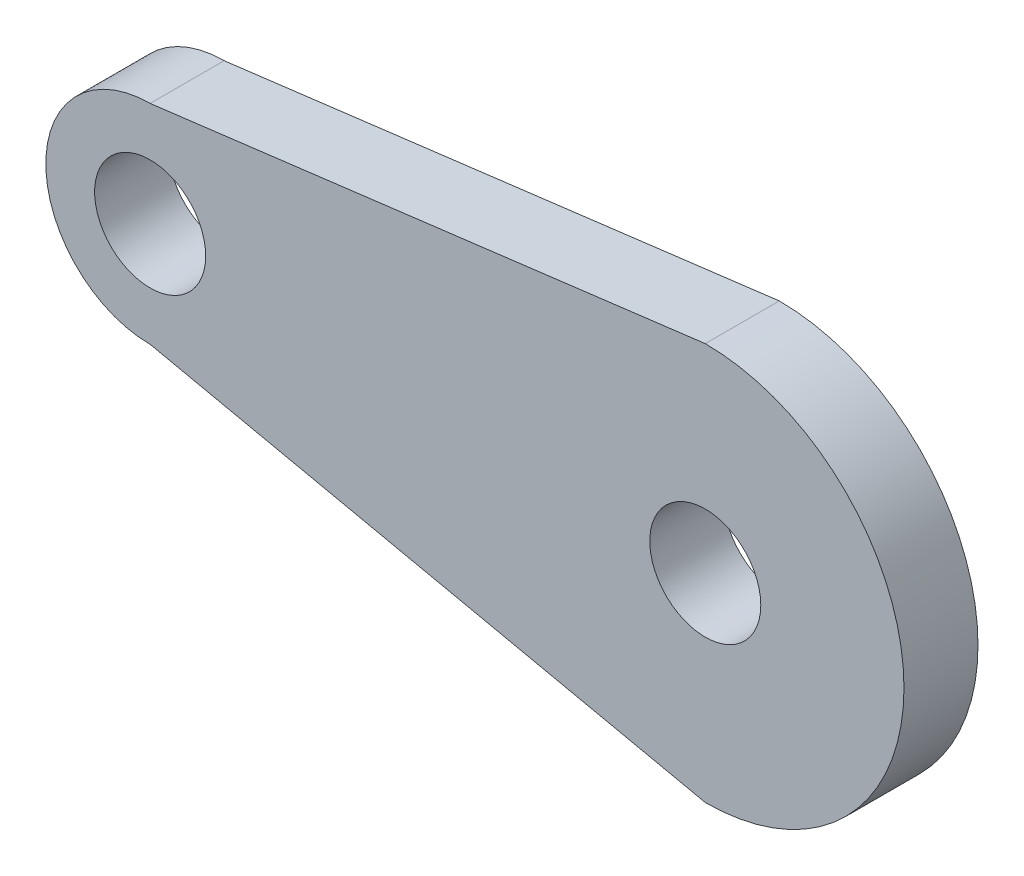
ISO-10303-21;
HEADER;
FILE_DESCRIPTION(('STEP AP214'),'2;1');
FILE_NAME('part.step','',(''),(''),'','','');
FILE_SCHEMA(('AUTOMOTIVE_DESIGN { 1 0 10303 214 1 1 1 1 }'));
ENDSEC;
DATA;
#1=APPLICATION_CONTEXT('core data for automotive mechanical design processes');
#2=APPLICATION_PROTOCOL_DEFINITION('international standard','automotive_design',2000,#1);
#3=PRODUCT_CONTEXT('',#1,'mechanical');
#4=PRODUCT('Part','Part','',(#3));
#5=PRODUCT_RELATED_PRODUCT_CATEGORY('part','',(#4));
#6=PRODUCT_DEFINITION_FORMATION('','',#4);
#7=PRODUCT_DEFINITION_CONTEXT('part definition',#1,'design');
#8=PRODUCT_DEFINITION('design','',#6,#7);
#9=PRODUCT_DEFINITION_SHAPE('','',#8);
#10=(LENGTH_UNIT() NAMED_UNIT(*) SI_UNIT(.MILLI.,.METRE.));
#11=(NAMED_UNIT(*) PLANE_ANGLE_UNIT() SI_UNIT($,.RADIAN.));
#12=(NAMED_UNIT(*) SI_UNIT($,.STERADIAN.) SOLID_ANGLE_UNIT());
#13=UNCERTAINTY_MEASURE_WITH_UNIT(LENGTH_MEASURE(1.E-05),#10,'distance_accuracy_value','');
#14=(GEOMETRIC_REPRESENTATION_CONTEXT(3) GLOBAL_UNCERTAINTY_ASSIGNED_CONTEXT((#13)) GLOBAL_UNIT_ASSIGNED_CONTEXT((#10,
#11,#12)) REPRESENTATION_CONTEXT('',''));
#15=CARTESIAN_POINT('',(0.,0.,0.));
#16=DIRECTION('',(0.,0.,1.));
#17=DIRECTION('',(1.,0.,0.));
#18=AXIS2_PLACEMENT_3D('',#15,#16,#17);
#19=CARTESIAN_POINT('',(0.,-2.81879194630873,2.));
#20=DIRECTION('',(0.,0.,-1.));
#21=DIRECTION('',(-1.,0.,0.));
#22=AXIS2_PLACEMENT_3D('',#19,#20,#21);
#23=CYLINDRICAL_SURFACE('',#22,2.81879194630873);
#24=CARTESIAN_POINT('',(0.,-2.81879194630873,0.));
#25=DIRECTION('',(0.,0.,1.));
#26=DIRECTION('',(1.,0.,0.));
#27=AXIS2_PLACEMENT_3D('',#24,#25,#26);
#28=CIRCLE('',#27,2.81879194630873);
#29=CARTESIAN_POINT('',(0.,0.,0.));
#30=VERTEX_POINT('',#29);
#31=CARTESIAN_POINT('',(0.,-5.63758389261745,0.));
#32=VERTEX_POINT('',#31);
#33=EDGE_CURVE('E107',#30,#32,#28,.T.);
#34=ORIENTED_EDGE('',*,*,#33,.T.);
#35=DIRECTION('',(0.,0.,-1.));
#36=VECTOR('',#35,1.);
#37=CARTESIAN_POINT('',(0.,-5.63758389261745,2.));
#38=LINE('',#37,#36);
#39=CARTESIAN_POINT('',(0.,-5.63758389261745,2.));
#40=VERTEX_POINT('',#39);
#41=EDGE_CURVE('E11',#40,#32,#38,.T.);
#42=ORIENTED_EDGE('',*,*,#41,.F.);
#43=CARTESIAN_POINT('',(0.,-2.81879194630873,2.));
#44=DIRECTION('',(0.,0.,1.));
#45=DIRECTION('',(1.,0.,0.));
#46=AXIS2_PLACEMENT_3D('',#43,#44,#45);
#47=CIRCLE('',#46,2.81879194630873);
#48=CARTESIAN_POINT('',(0.,0.,2.));
#49=VERTEX_POINT('',#48);
#50=EDGE_CURVE('E87',#49,#40,#47,.T.);
#51=ORIENTED_EDGE('',*,*,#50,.F.);
#52=DIRECTION('',(0.,0.,-1.));
#53=VECTOR('',#52,1.);
#54=CARTESIAN_POINT('',(0.,0.,2.));
#55=LINE('',#54,#53);
#56=EDGE_CURVE('E53',#49,#30,#55,.T.);
#57=ORIENTED_EDGE('',*,*,#56,.T.);
#58=EDGE_LOOP('',(#34,#42,#51,#57));
#59=FACE_BOUND('',#58,.T.);
#60=ADVANCED_FACE('F37',(#59),#23,.T.);
#61=CARTESIAN_POINT('',(-1.15737351991389,-5.38902045209903,2.));
#62=DIRECTION('',(0.209977188775932,0.977706285237932,0.));
#63=DIRECTION('',(-0.977706285237932,0.209977188775932,0.));
#64=AXIS2_PLACEMENT_3D('',#61,#62,#63);
#65=PLANE('',#64);
#66=DIRECTION('',(0.977706285237932,-0.209977188775932,0.));
#67=VECTOR('',#66,1.);
#68=CARTESIAN_POINT('',(-1.15737351991389,-5.38902045209903,0.));
#69=LINE('',#68,#67);
#70=CARTESIAN_POINT('',(15.,-8.85906040268457,0.));
#71=VERTEX_POINT('',#70);
#72=EDGE_CURVE('E92',#32,#71,#69,.T.);
#73=ORIENTED_EDGE('',*,*,#72,.T.);
#74=DIRECTION('',(0.,0.,-1.));
#75=VECTOR('',#74,1.);
#76=CARTESIAN_POINT('',(15.,-8.85906040268457,2.));
#77=LINE('',#76,#75);
#78=CARTESIAN_POINT('',(15.,-8.85906040268457,2.));
#79=VERTEX_POINT('',#78);
#80=EDGE_CURVE('E45',#79,#71,#77,.T.);
#81=ORIENTED_EDGE('',*,*,#80,.F.);
#82=DIRECTION('',(0.977706285237932,-0.209977188775932,0.));
#83=VECTOR('',#82,1.);
#84=CARTESIAN_POINT('',(-1.15737351991389,-5.38902045209903,2.));
#85=LINE('',#84,#83);
#86=EDGE_CURVE('E78',#40,#79,#85,.T.);
#87=ORIENTED_EDGE('',*,*,#86,.F.);
#88=ORIENTED_EDGE('',*,*,#41,.T.);
#89=EDGE_LOOP('',(#73,#81,#87,#88));
#90=FACE_BOUND('',#89,.T.);
#91=ADVANCED_FACE('F91',(#90),#65,.F.);
#92=CARTESIAN_POINT('',(15.,-3.48993288590604,2.));
#93=DIRECTION('',(0.,0.,-1.));
#94=DIRECTION('',(-1.,0.,0.));
#95=AXIS2_PLACEMENT_3D('',#92,#93,#94);
#96=CYLINDRICAL_SURFACE('',#95,5.36912751677853);
#97=CARTESIAN_POINT('',(15.,-3.48993288590604,0.));
#98=DIRECTION('',(0.,0.,1.));
#99=DIRECTION('',(1.,0.,0.));
#100=AXIS2_PLACEMENT_3D('',#97,#98,#99);
#101=CIRCLE('',#100,5.36912751677853);
#102=CARTESIAN_POINT('',(15.,1.87919463087248,0.));
#103=VERTEX_POINT('',#102);
#104=EDGE_CURVE('E110',#103,#71,#101,.F.);
#105=ORIENTED_EDGE('',*,*,#104,.F.);
#106=DIRECTION('',(0.,0.,-1.));
#107=VECTOR('',#106,1.);
#108=CARTESIAN_POINT('',(15.,1.87919463087248,2.));
#109=LINE('',#108,#107);
#110=CARTESIAN_POINT('',(15.,1.87919463087248,2.));
#111=VERTEX_POINT('',#110);
#112=EDGE_CURVE('E67',#111,#103,#109,.T.);
#113=ORIENTED_EDGE('',*,*,#112,.F.);
#114=CARTESIAN_POINT('',(15.,-3.48993288590604,2.));
#115=DIRECTION('',(0.,0.,1.));
#116=DIRECTION('',(1.,0.,0.));
#117=AXIS2_PLACEMENT_3D('',#114,#115,#116);
#118=CIRCLE('',#117,5.36912751677853);
#119=EDGE_CURVE('E86',#111,#79,#118,.F.);
#120=ORIENTED_EDGE('',*,*,#119,.T.);
#121=ORIENTED_EDGE('',*,*,#80,.T.);
#122=EDGE_LOOP('',(#105,#113,#120,#121));
#123=FACE_BOUND('',#122,.T.);
#124=ADVANCED_FACE('F95',(#123),#96,.T.);
#125=CARTESIAN_POINT('',(0.,-2.81879194630873,2.));
#126=DIRECTION('',(0.,0.,-1.));
#127=DIRECTION('',(-1.,0.,0.));
#128=AXIS2_PLACEMENT_3D('',#125,#126,#127);
#129=CYLINDRICAL_SURFACE('',#128,1.5);
#130=CARTESIAN_POINT('',(0.,-2.81879194630873,2.));
#131=DIRECTION('',(0.,0.,1.));
#132=DIRECTION('',(1.,0.,0.));
#133=AXIS2_PLACEMENT_3D('',#130,#131,#132);
#134=CIRCLE('',#133,1.5);
#135=CARTESIAN_POINT('',(1.5,-2.81879194630873,2.));
#136=VERTEX_POINT('',#135);
#137=EDGE_CURVE('E98',#136,#136,#134,.T.);
#138=ORIENTED_EDGE('',*,*,#137,.T.);
#139=EDGE_LOOP('',(#138));
#140=FACE_BOUND('',#139,.T.);
#141=CARTESIAN_POINT('',(0.,-2.81879194630873,0.));
#142=DIRECTION('',(0.,0.,1.));
#143=DIRECTION('',(1.,0.,0.));
#144=AXIS2_PLACEMENT_3D('',#141,#142,#143);
#145=CIRCLE('',#144,1.5);
#146=CARTESIAN_POINT('',(1.5,-2.81879194630873,0.));
#147=VERTEX_POINT('',#146);
#148=EDGE_CURVE('E115',#147,#147,#145,.T.);
#149=ORIENTED_EDGE('',*,*,#148,.F.);
#150=EDGE_LOOP('',(#149));
#151=FACE_BOUND('',#150,.T.);
#152=ADVANCED_FACE('F136',(#140,#151),#129,.F.);
#153=CARTESIAN_POINT('',(0.,0.,2.));
#154=DIRECTION('',(-0.124307934138723,0.992243688571594,0.));
#155=DIRECTION('',(-0.992243688571594,-0.124307934138723,0.));
#156=AXIS2_PLACEMENT_3D('',#153,#154,#155);
#157=PLANE('',#156);
#158=DIRECTION('',(0.992243688571594,0.124307934138723,0.));
#159=VECTOR('',#158,1.);
#160=CARTESIAN_POINT('',(0.,0.,0.));
#161=LINE('',#160,#159);
#162=EDGE_CURVE('E112',#30,#103,#161,.T.);
#163=ORIENTED_EDGE('',*,*,#162,.F.);
#164=ORIENTED_EDGE('',*,*,#56,.F.);
#165=DIRECTION('',(0.992243688571594,0.124307934138723,0.));
#166=VECTOR('',#165,1.);
#167=CARTESIAN_POINT('',(0.,0.,2.));
#168=LINE('',#167,#166);
#169=EDGE_CURVE('E96',#49,#111,#168,.T.);
#170=ORIENTED_EDGE('',*,*,#169,.T.);
#171=ORIENTED_EDGE('',*,*,#112,.T.);
#172=EDGE_LOOP('',(#163,#164,#170,#171));
#173=FACE_BOUND('',#172,.T.);
#174=ADVANCED_FACE('F128',(#173),#157,.T.);
#175=CARTESIAN_POINT('',(15.,-3.48993288590604,2.));
#176=DIRECTION('',(0.,0.,-1.));
#177=DIRECTION('',(-1.,0.,0.));
#178=AXIS2_PLACEMENT_3D('',#175,#176,#177);
#179=CYLINDRICAL_SURFACE('',#178,1.5);
#180=CARTESIAN_POINT('',(15.,-3.48993288590604,2.));
#181=DIRECTION('',(0.,0.,1.));
#182=DIRECTION('',(1.,0.,0.));
#183=AXIS2_PLACEMENT_3D('',#180,#181,#182);
#184=CIRCLE('',#183,1.5);
#185=CARTESIAN_POINT('',(16.5,-3.48993288590604,2.));
#186=VERTEX_POINT('',#185);
#187=EDGE_CURVE('E104',#186,#186,#184,.T.);
#188=ORIENTED_EDGE('',*,*,#187,.T.);
#189=EDGE_LOOP('',(#188));
#190=FACE_BOUND('',#189,.T.);
#191=CARTESIAN_POINT('',(15.,-3.48993288590604,0.));
#192=DIRECTION('',(0.,0.,1.));
#193=DIRECTION('',(1.,0.,0.));
#194=AXIS2_PLACEMENT_3D('',#191,#192,#193);
#195=CIRCLE('',#194,1.5);
#196=CARTESIAN_POINT('',(16.5,-3.48993288590604,0.));
#197=VERTEX_POINT('',#196);
#198=EDGE_CURVE('E118',#197,#197,#195,.T.);
#199=ORIENTED_EDGE('',*,*,#198,.F.);
#200=EDGE_LOOP('',(#199));
#201=FACE_BOUND('',#200,.T.);
#202=ADVANCED_FACE('F126',(#190,#201),#179,.F.);
#203=CARTESIAN_POINT('',(0.,0.,2.));
#204=DIRECTION('',(0.,0.,1.));
#205=DIRECTION('',(1.,0.,0.));
#206=AXIS2_PLACEMENT_3D('',#203,#204,#205);
#207=PLANE('',#206);
#208=ORIENTED_EDGE('',*,*,#50,.T.);
#209=ORIENTED_EDGE('',*,*,#86,.T.);
#210=ORIENTED_EDGE('',*,*,#119,.F.);
#211=ORIENTED_EDGE('',*,*,#169,.F.);
#212=EDGE_LOOP('',(#208,#209,#210,#211));
#213=FACE_BOUND('',#212,.T.);
#214=ORIENTED_EDGE('',*,*,#137,.F.);
#215=EDGE_LOOP('',(#214));
#216=FACE_BOUND('',#215,.T.);
#217=ORIENTED_EDGE('',*,*,#187,.F.);
#218=EDGE_LOOP('',(#217));
#219=FACE_BOUND('',#218,.T.);
#220=ADVANCED_FACE('F82',(#213,#216,#219),#207,.T.);
#221=CARTESIAN_POINT('',(0.,0.,0.));
#222=DIRECTION('',(0.,0.,1.));
#223=DIRECTION('',(1.,0.,0.));
#224=AXIS2_PLACEMENT_3D('',#221,#222,#223);
#225=PLANE('',#224);
#226=ORIENTED_EDGE('',*,*,#33,.F.);
#227=ORIENTED_EDGE('',*,*,#162,.T.);
#228=ORIENTED_EDGE('',*,*,#104,.T.);
#229=ORIENTED_EDGE('',*,*,#72,.F.);
#230=EDGE_LOOP('',(#226,#227,#228,#229));
#231=FACE_BOUND('',#230,.T.);
#232=ORIENTED_EDGE('',*,*,#148,.T.);
#233=EDGE_LOOP('',(#232));
#234=FACE_BOUND('',#233,.T.);
#235=ORIENTED_EDGE('',*,*,#198,.T.);
#236=EDGE_LOOP('',(#235));
#237=FACE_BOUND('',#236,.T.);
#238=ADVANCED_FACE('F124',(#231,#234,#237),#225,.F.);
#239=CLOSED_SHELL('',(#60,#91,#124,#152,#174,#202,#220,#238));
#240=MANIFOLD_SOLID_BREP('B2',#239);
#241=ADVANCED_BREP_SHAPE_REPRESENTATION('',(#18,#240),#14);
#242=SHAPE_DEFINITION_REPRESENTATION(#9,#241);
ENDSEC;
END-ISO-10303-21;
